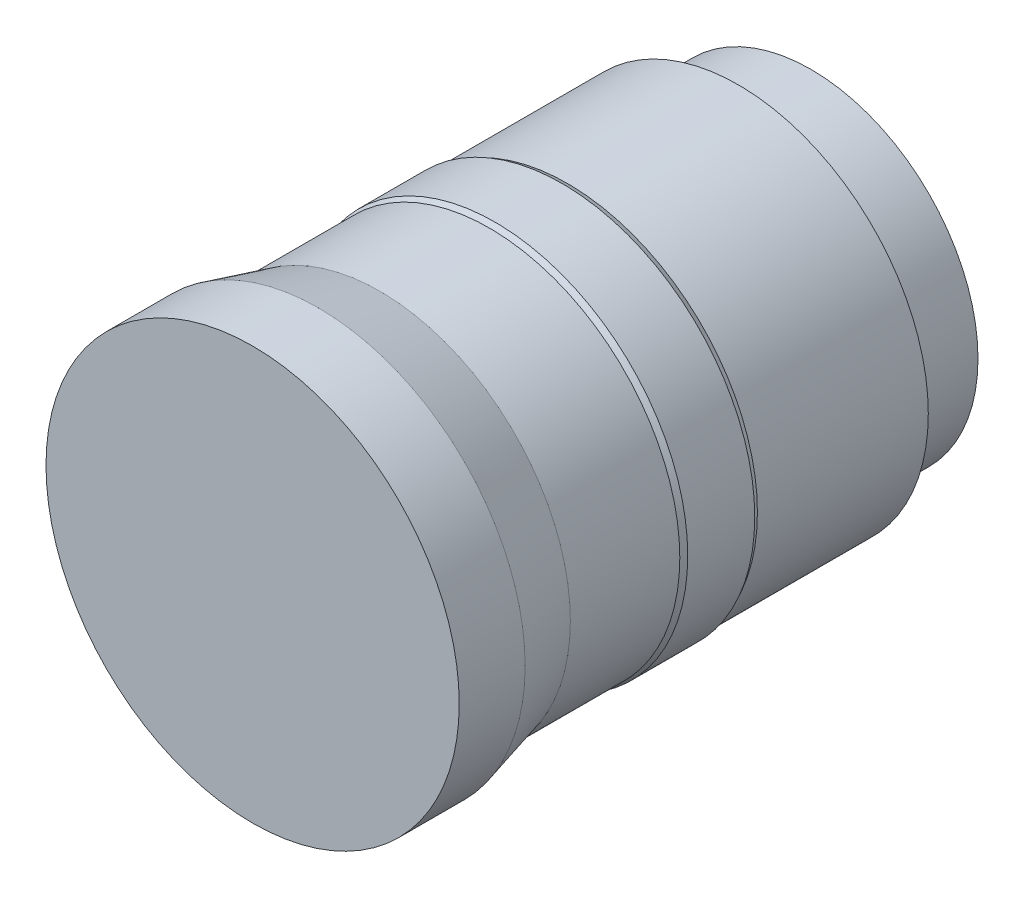
ISO-10303-21;
HEADER;
FILE_DESCRIPTION(('STEP AP214'),'2;1');
FILE_NAME('part.step','',(''),(''),'','','');
FILE_SCHEMA(('AUTOMOTIVE_DESIGN { 1 0 10303 214 1 1 1 1 }'));
ENDSEC;
DATA;
#1=APPLICATION_CONTEXT('core data for automotive mechanical design processes');
#2=APPLICATION_PROTOCOL_DEFINITION('international standard','automotive_design',2000,#1);
#3=PRODUCT_CONTEXT('',#1,'mechanical');
#4=PRODUCT('Part','Part','',(#3));
#5=PRODUCT_RELATED_PRODUCT_CATEGORY('part','',(#4));
#6=PRODUCT_DEFINITION_FORMATION('','',#4);
#7=PRODUCT_DEFINITION_CONTEXT('part definition',#1,'design');
#8=PRODUCT_DEFINITION('design','',#6,#7);
#9=PRODUCT_DEFINITION_SHAPE('','',#8);
#10=(LENGTH_UNIT() NAMED_UNIT(*) SI_UNIT(.MILLI.,.METRE.));
#11=(NAMED_UNIT(*) PLANE_ANGLE_UNIT() SI_UNIT($,.RADIAN.));
#12=(NAMED_UNIT(*) SI_UNIT($,.STERADIAN.) SOLID_ANGLE_UNIT());
#13=UNCERTAINTY_MEASURE_WITH_UNIT(LENGTH_MEASURE(1.E-05),#10,'distance_accuracy_value','');
#14=(GEOMETRIC_REPRESENTATION_CONTEXT(3) GLOBAL_UNCERTAINTY_ASSIGNED_CONTEXT((#13)) GLOBAL_UNIT_ASSIGNED_CONTEXT((#10,
#11,#12)) REPRESENTATION_CONTEXT('',''));
#15=CARTESIAN_POINT('',(0.,0.,0.));
#16=DIRECTION('',(0.,0.,1.));
#17=DIRECTION('',(1.,0.,0.));
#18=AXIS2_PLACEMENT_3D('',#15,#16,#17);
#19=CARTESIAN_POINT('',(0.,0.,0.));
#20=DIRECTION('',(0.,0.,1.));
#21=DIRECTION('',(1.,0.,0.));
#22=AXIS2_PLACEMENT_3D('',#19,#20,#21);
#23=PLANE('',#22);
#24=CARTESIAN_POINT('',(0.,0.,0.));
#25=DIRECTION('',(0.,0.,1.));
#26=DIRECTION('',(1.,0.,0.));
#27=AXIS2_PLACEMENT_3D('',#24,#25,#26);
#28=CIRCLE('',#27,14.95);
#29=CARTESIAN_POINT('',(14.95,0.,0.));
#30=VERTEX_POINT('',#29);
#31=EDGE_CURVE('E10',#30,#30,#28,.T.);
#32=ORIENTED_EDGE('',*,*,#31,.F.);
#33=EDGE_LOOP('',(#32));
#34=FACE_BOUND('',#33,.T.);
#35=ADVANCED_FACE('F38',(#34),#23,.F.);
#36=CARTESIAN_POINT('',(0.,0.,50.));
#37=DIRECTION('',(0.,0.,1.));
#38=DIRECTION('',(1.,0.,0.));
#39=AXIS2_PLACEMENT_3D('',#36,#37,#38);
#40=CYLINDRICAL_SURFACE('',#39,14.95);
#41=CARTESIAN_POINT('',(0.,0.,6.5));
#42=DIRECTION('',(0.,0.,1.));
#43=DIRECTION('',(1.,0.,0.));
#44=AXIS2_PLACEMENT_3D('',#41,#42,#43);
#45=CIRCLE('',#44,14.95);
#46=CARTESIAN_POINT('',(14.95,0.,6.5));
#47=VERTEX_POINT('',#46);
#48=EDGE_CURVE('E44',#47,#47,#45,.T.);
#49=ORIENTED_EDGE('',*,*,#48,.F.);
#50=EDGE_LOOP('',(#49));
#51=FACE_BOUND('',#50,.T.);
#52=ORIENTED_EDGE('',*,*,#31,.T.);
#53=EDGE_LOOP('',(#52));
#54=FACE_BOUND('',#53,.T.);
#55=ADVANCED_FACE('F122',(#51,#54),#40,.T.);
#56=CARTESIAN_POINT('',(0.,14.95,6.5));
#57=DIRECTION('',(0.,0.,1.));
#58=DIRECTION('',(1.,0.,0.));
#59=AXIS2_PLACEMENT_3D('',#56,#57,#58);
#60=PLANE('',#59);
#61=CARTESIAN_POINT('',(0.,0.,6.5));
#62=DIRECTION('',(0.,0.,1.));
#63=DIRECTION('',(1.,0.,0.));
#64=AXIS2_PLACEMENT_3D('',#61,#62,#63);
#65=CIRCLE('',#64,17.);
#66=CARTESIAN_POINT('',(17.,0.,6.5));
#67=VERTEX_POINT('',#66);
#68=EDGE_CURVE('E48',#67,#67,#65,.T.);
#69=ORIENTED_EDGE('',*,*,#68,.F.);
#70=EDGE_LOOP('',(#69));
#71=FACE_BOUND('',#70,.T.);
#72=ORIENTED_EDGE('',*,*,#48,.T.);
#73=EDGE_LOOP('',(#72));
#74=FACE_BOUND('',#73,.T.);
#75=ADVANCED_FACE('F117',(#71,#74),#60,.F.);
#76=CARTESIAN_POINT('',(0.,0.,50.));
#77=DIRECTION('',(0.,0.,1.));
#78=DIRECTION('',(1.,0.,0.));
#79=AXIS2_PLACEMENT_3D('',#76,#77,#78);
#80=CYLINDRICAL_SURFACE('',#79,17.);
#81=CARTESIAN_POINT('',(0.,0.,21.8));
#82=DIRECTION('',(0.,0.,1.));
#83=DIRECTION('',(1.,0.,0.));
#84=AXIS2_PLACEMENT_3D('',#81,#82,#83);
#85=CIRCLE('',#84,17.);
#86=CARTESIAN_POINT('',(17.,0.,21.8));
#87=VERTEX_POINT('',#86);
#88=EDGE_CURVE('E52',#87,#87,#85,.T.);
#89=ORIENTED_EDGE('',*,*,#88,.F.);
#90=EDGE_LOOP('',(#89));
#91=FACE_BOUND('',#90,.T.);
#92=ORIENTED_EDGE('',*,*,#68,.T.);
#93=EDGE_LOOP('',(#92));
#94=FACE_BOUND('',#93,.T.);
#95=ADVANCED_FACE('F111',(#91,#94),#80,.T.);
#96=CARTESIAN_POINT('',(0.,0.,21.8));
#97=DIRECTION('',(0.,0.,1.));
#98=DIRECTION('',(1.,0.,0.));
#99=AXIS2_PLACEMENT_3D('',#96,#97,#98);
#100=CONICAL_SURFACE('',#99,17.,0.472812321854876);
#101=CARTESIAN_POINT('',(0.,0.,22.28875));
#102=DIRECTION('',(0.,0.,1.));
#103=DIRECTION('',(1.,0.,0.));
#104=AXIS2_PLACEMENT_3D('',#101,#102,#103);
#105=CIRCLE('',#104,17.25);
#106=CARTESIAN_POINT('',(17.25,0.,22.28875));
#107=VERTEX_POINT('',#106);
#108=EDGE_CURVE('E57',#107,#107,#105,.T.);
#109=ORIENTED_EDGE('',*,*,#108,.F.);
#110=EDGE_LOOP('',(#109));
#111=FACE_BOUND('',#110,.T.);
#112=ORIENTED_EDGE('',*,*,#88,.T.);
#113=EDGE_LOOP('',(#112));
#114=FACE_BOUND('',#113,.T.);
#115=ADVANCED_FACE('F105',(#111,#114),#100,.T.);
#116=CARTESIAN_POINT('',(0.,0.,50.));
#117=DIRECTION('',(0.,0.,1.));
#118=DIRECTION('',(1.,0.,0.));
#119=AXIS2_PLACEMENT_3D('',#116,#117,#118);
#120=CYLINDRICAL_SURFACE('',#119,17.25);
#121=CARTESIAN_POINT('',(0.,0.,28.28875));
#122=DIRECTION('',(0.,0.,1.));
#123=DIRECTION('',(1.,0.,0.));
#124=AXIS2_PLACEMENT_3D('',#121,#122,#123);
#125=CIRCLE('',#124,17.25);
#126=CARTESIAN_POINT('',(17.25,0.,28.28875));
#127=VERTEX_POINT('',#126);
#128=EDGE_CURVE('E60',#127,#127,#125,.T.);
#129=ORIENTED_EDGE('',*,*,#128,.F.);
#130=EDGE_LOOP('',(#129));
#131=FACE_BOUND('',#130,.T.);
#132=ORIENTED_EDGE('',*,*,#108,.T.);
#133=EDGE_LOOP('',(#132));
#134=FACE_BOUND('',#133,.T.);
#135=ADVANCED_FACE('F99',(#131,#134),#120,.T.);
#136=CARTESIAN_POINT('',(0.,0.,28.28875));
#137=DIRECTION('',(0.,0.,-1.));
#138=DIRECTION('',(-1.,0.,0.));
#139=AXIS2_PLACEMENT_3D('',#136,#137,#138);
#140=CONICAL_SURFACE('',#139,17.25,0.372895530410995);
#141=CARTESIAN_POINT('',(0.,0.,28.8));
#142=DIRECTION('',(0.,0.,1.));
#143=DIRECTION('',(1.,0.,0.));
#144=AXIS2_PLACEMENT_3D('',#141,#142,#143);
#145=CIRCLE('',#144,17.05);
#146=CARTESIAN_POINT('',(17.05,0.,28.8));
#147=VERTEX_POINT('',#146);
#148=EDGE_CURVE('E63',#147,#147,#145,.T.);
#149=ORIENTED_EDGE('',*,*,#148,.F.);
#150=EDGE_LOOP('',(#149));
#151=FACE_BOUND('',#150,.T.);
#152=ORIENTED_EDGE('',*,*,#128,.T.);
#153=EDGE_LOOP('',(#152));
#154=FACE_BOUND('',#153,.T.);
#155=ADVANCED_FACE('F93',(#151,#154),#140,.T.);
#156=CARTESIAN_POINT('',(0.,0.,50.));
#157=DIRECTION('',(0.,0.,1.));
#158=DIRECTION('',(1.,0.,0.));
#159=AXIS2_PLACEMENT_3D('',#156,#157,#158);
#160=CYLINDRICAL_SURFACE('',#159,17.05);
#161=CARTESIAN_POINT('',(0.,0.,38.6));
#162=DIRECTION('',(0.,0.,1.));
#163=DIRECTION('',(1.,0.,0.));
#164=AXIS2_PLACEMENT_3D('',#161,#162,#163);
#165=CIRCLE('',#164,17.05);
#166=CARTESIAN_POINT('',(17.05,0.,38.6));
#167=VERTEX_POINT('',#166);
#168=EDGE_CURVE('E66',#167,#167,#165,.T.);
#169=ORIENTED_EDGE('',*,*,#168,.F.);
#170=EDGE_LOOP('',(#169));
#171=FACE_BOUND('',#170,.T.);
#172=ORIENTED_EDGE('',*,*,#148,.T.);
#173=EDGE_LOOP('',(#172));
#174=FACE_BOUND('',#173,.T.);
#175=ADVANCED_FACE('F87',(#171,#174),#160,.T.);
#176=CARTESIAN_POINT('',(0.,0.,38.6));
#177=DIRECTION('',(0.,0.,1.));
#178=DIRECTION('',(1.,0.,0.));
#179=AXIS2_PLACEMENT_3D('',#176,#177,#178);
#180=CONICAL_SURFACE('',#179,17.05,0.257771142234297);
#181=CARTESIAN_POINT('',(0.,0.,44.1));
#182=DIRECTION('',(0.,0.,1.));
#183=DIRECTION('',(1.,0.,0.));
#184=AXIS2_PLACEMENT_3D('',#181,#182,#183);
#185=CIRCLE('',#184,18.5);
#186=CARTESIAN_POINT('',(18.5,0.,44.1));
#187=VERTEX_POINT('',#186);
#188=EDGE_CURVE('E69',#187,#187,#185,.T.);
#189=ORIENTED_EDGE('',*,*,#188,.F.);
#190=EDGE_LOOP('',(#189));
#191=FACE_BOUND('',#190,.T.);
#192=ORIENTED_EDGE('',*,*,#168,.T.);
#193=EDGE_LOOP('',(#192));
#194=FACE_BOUND('',#193,.T.);
#195=ADVANCED_FACE('F81',(#191,#194),#180,.T.);
#196=CARTESIAN_POINT('',(0.,0.,50.));
#197=DIRECTION('',(0.,0.,1.));
#198=DIRECTION('',(1.,0.,0.));
#199=AXIS2_PLACEMENT_3D('',#196,#197,#198);
#200=CYLINDRICAL_SURFACE('',#199,18.5);
#201=CARTESIAN_POINT('',(0.,0.,50.));
#202=DIRECTION('',(0.,0.,1.));
#203=DIRECTION('',(1.,0.,0.));
#204=AXIS2_PLACEMENT_3D('',#201,#202,#203);
#205=CIRCLE('',#204,18.5);
#206=CARTESIAN_POINT('',(18.5,0.,50.));
#207=VERTEX_POINT('',#206);
#208=EDGE_CURVE('E72',#207,#207,#205,.T.);
#209=ORIENTED_EDGE('',*,*,#208,.F.);
#210=EDGE_LOOP('',(#209));
#211=FACE_BOUND('',#210,.T.);
#212=ORIENTED_EDGE('',*,*,#188,.T.);
#213=EDGE_LOOP('',(#212));
#214=FACE_BOUND('',#213,.T.);
#215=ADVANCED_FACE('F78',(#211,#214),#200,.T.);
#216=CARTESIAN_POINT('',(0.,18.5,50.));
#217=DIRECTION('',(0.,0.,-1.));
#218=DIRECTION('',(-1.,0.,0.));
#219=AXIS2_PLACEMENT_3D('',#216,#217,#218);
#220=PLANE('',#219);
#221=ORIENTED_EDGE('',*,*,#208,.T.);
#222=EDGE_LOOP('',(#221));
#223=FACE_BOUND('',#222,.T.);
#224=ADVANCED_FACE('F76',(#223),#220,.F.);
#225=CLOSED_SHELL('',(#35,#55,#75,#95,#115,#135,#155,#175,#195,#215,#224));
#226=MANIFOLD_SOLID_BREP('B2',#225);
#227=ADVANCED_BREP_SHAPE_REPRESENTATION('',(#18,#226),#14);
#228=SHAPE_DEFINITION_REPRESENTATION(#9,#227);
ENDSEC;
END-ISO-10303-21;
